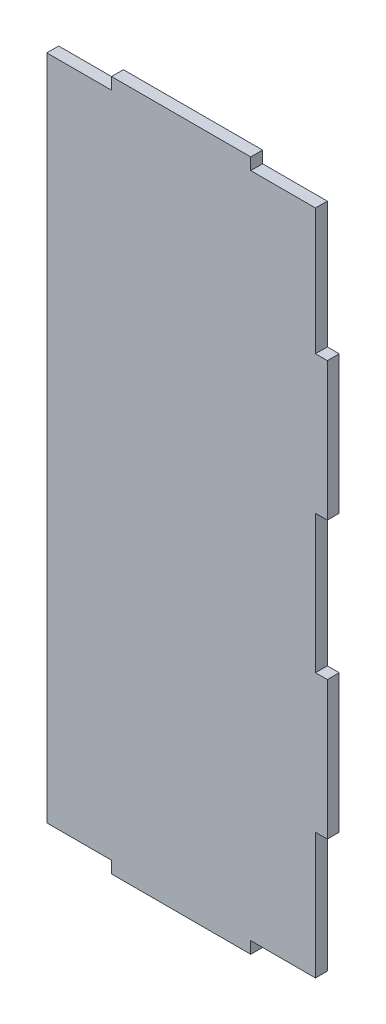
ISO-10303-21;
HEADER;
FILE_DESCRIPTION(('STEP AP214'),'2;1');
FILE_NAME('part.step','',(''),(''),'','','');
FILE_SCHEMA(('AUTOMOTIVE_DESIGN { 1 0 10303 214 1 1 1 1 }'));
ENDSEC;
DATA;
#1=APPLICATION_CONTEXT('core data for automotive mechanical design processes');
#2=APPLICATION_PROTOCOL_DEFINITION('international standard','automotive_design',2000,#1);
#3=PRODUCT_CONTEXT('',#1,'mechanical');
#4=PRODUCT('Part','Part','',(#3));
#5=PRODUCT_RELATED_PRODUCT_CATEGORY('part','',(#4));
#6=PRODUCT_DEFINITION_FORMATION('','',#4);
#7=PRODUCT_DEFINITION_CONTEXT('part definition',#1,'design');
#8=PRODUCT_DEFINITION('design','',#6,#7);
#9=PRODUCT_DEFINITION_SHAPE('','',#8);
#10=(LENGTH_UNIT() NAMED_UNIT(*) SI_UNIT(.MILLI.,.METRE.));
#11=(NAMED_UNIT(*) PLANE_ANGLE_UNIT() SI_UNIT($,.RADIAN.));
#12=(NAMED_UNIT(*) SI_UNIT($,.STERADIAN.) SOLID_ANGLE_UNIT());
#13=UNCERTAINTY_MEASURE_WITH_UNIT(LENGTH_MEASURE(1.E-05),#10,'distance_accuracy_value','');
#14=(GEOMETRIC_REPRESENTATION_CONTEXT(3) GLOBAL_UNCERTAINTY_ASSIGNED_CONTEXT((#13)) GLOBAL_UNIT_ASSIGNED_CONTEXT((#10,
#11,#12)) REPRESENTATION_CONTEXT('',''));
#15=CARTESIAN_POINT('',(0.,0.,0.));
#16=DIRECTION('',(0.,0.,1.));
#17=DIRECTION('',(1.,0.,0.));
#18=AXIS2_PLACEMENT_3D('',#15,#16,#17);
#19=CARTESIAN_POINT('',(75.4269948953106,366.820828603859,5.5));
#20=DIRECTION('',(-1.,0.,0.));
#21=DIRECTION('',(0.,0.,1.));
#22=AXIS2_PLACEMENT_3D('',#19,#20,#21);
#23=PLANE('',#22);
#24=DIRECTION('',(0.,1.,0.));
#25=VECTOR('',#24,1.);
#26=CARTESIAN_POINT('',(75.4269948953106,366.820828603859,0.));
#27=LINE('',#26,#25);
#28=CARTESIAN_POINT('',(75.4269948953106,308.320828603859,0.));
#29=VERTEX_POINT('',#28);
#30=CARTESIAN_POINT('',(75.4269948953106,366.820828603859,0.));
#31=VERTEX_POINT('',#30);
#32=EDGE_CURVE('E200',#29,#31,#27,.T.);
#33=ORIENTED_EDGE('',*,*,#32,.T.);
#34=DIRECTION('',(0.,0.,-1.));
#35=VECTOR('',#34,1.);
#36=CARTESIAN_POINT('',(75.4269948953106,366.820828603859,5.5));
#37=LINE('',#36,#35);
#38=CARTESIAN_POINT('',(75.4269948953106,366.820828603859,5.5));
#39=VERTEX_POINT('',#38);
#40=EDGE_CURVE('E11',#39,#31,#37,.T.);
#41=ORIENTED_EDGE('',*,*,#40,.F.);
#42=DIRECTION('',(0.,1.,0.));
#43=VECTOR('',#42,1.);
#44=CARTESIAN_POINT('',(75.4269948953106,366.820828603859,5.5));
#45=LINE('',#44,#43);
#46=CARTESIAN_POINT('',(75.4269948953106,308.320828603859,5.5));
#47=VERTEX_POINT('',#46);
#48=EDGE_CURVE('E238',#47,#39,#45,.T.);
#49=ORIENTED_EDGE('',*,*,#48,.F.);
#50=DIRECTION('',(0.,0.,-1.));
#51=VECTOR('',#50,1.);
#52=CARTESIAN_POINT('',(75.4269948953106,308.320828603859,5.5));
#53=LINE('',#52,#51);
#54=EDGE_CURVE('E196',#47,#29,#53,.T.);
#55=ORIENTED_EDGE('',*,*,#54,.T.);
#56=EDGE_LOOP('',(#33,#41,#49,#55));
#57=FACE_BOUND('',#56,.T.);
#58=ADVANCED_FACE('F32',(#57),#23,.F.);
#59=CARTESIAN_POINT('',(45.4269948953106,366.820828603859,5.5));
#60=DIRECTION('',(0.,-1.,0.));
#61=DIRECTION('',(0.,0.,-1.));
#62=AXIS2_PLACEMENT_3D('',#59,#60,#61);
#63=PLANE('',#62);
#64=DIRECTION('',(-1.,0.,0.));
#65=VECTOR('',#64,1.);
#66=CARTESIAN_POINT('',(45.4269948953106,366.820828603859,0.));
#67=LINE('',#66,#65);
#68=CARTESIAN_POINT('',(45.4269948953106,366.820828603859,0.));
#69=VERTEX_POINT('',#68);
#70=EDGE_CURVE('E203',#31,#69,#67,.T.);
#71=ORIENTED_EDGE('',*,*,#70,.T.);
#72=DIRECTION('',(0.,0.,-1.));
#73=VECTOR('',#72,1.);
#74=CARTESIAN_POINT('',(45.4269948953106,366.820828603859,5.5));
#75=LINE('',#74,#73);
#76=CARTESIAN_POINT('',(45.4269948953106,366.820828603859,5.5));
#77=VERTEX_POINT('',#76);
#78=EDGE_CURVE('E40',#77,#69,#75,.T.);
#79=ORIENTED_EDGE('',*,*,#78,.F.);
#80=DIRECTION('',(-1.,0.,0.));
#81=VECTOR('',#80,1.);
#82=CARTESIAN_POINT('',(45.4269948953106,366.820828603859,5.5));
#83=LINE('',#82,#81);
#84=EDGE_CURVE('E127',#39,#77,#83,.T.);
#85=ORIENTED_EDGE('',*,*,#84,.F.);
#86=ORIENTED_EDGE('',*,*,#40,.T.);
#87=EDGE_LOOP('',(#71,#79,#85,#86));
#88=FACE_BOUND('',#87,.T.);
#89=ADVANCED_FACE('F356',(#88),#63,.F.);
#90=CARTESIAN_POINT('',(45.4269948953106,366.820828603859,5.5));
#91=DIRECTION('',(-1.,0.,0.));
#92=DIRECTION('',(0.,0.,1.));
#93=AXIS2_PLACEMENT_3D('',#90,#91,#92);
#94=PLANE('',#93);
#95=DIRECTION('',(0.,1.,0.));
#96=VECTOR('',#95,1.);
#97=CARTESIAN_POINT('',(45.4269948953106,366.820828603859,0.));
#98=LINE('',#97,#96);
#99=CARTESIAN_POINT('',(45.4269948953106,372.320828603859,0.));
#100=VERTEX_POINT('',#99);
#101=EDGE_CURVE('E205',#69,#100,#98,.T.);
#102=ORIENTED_EDGE('',*,*,#101,.T.);
#103=DIRECTION('',(0.,0.,-1.));
#104=VECTOR('',#103,1.);
#105=CARTESIAN_POINT('',(45.4269948953106,372.320828603859,5.5));
#106=LINE('',#105,#104);
#107=CARTESIAN_POINT('',(45.4269948953106,372.320828603859,5.5));
#108=VERTEX_POINT('',#107);
#109=EDGE_CURVE('E281',#108,#100,#106,.T.);
#110=ORIENTED_EDGE('',*,*,#109,.F.);
#111=DIRECTION('',(0.,1.,0.));
#112=VECTOR('',#111,1.);
#113=CARTESIAN_POINT('',(45.4269948953106,366.820828603859,5.5));
#114=LINE('',#113,#112);
#115=EDGE_CURVE('E289',#77,#108,#114,.T.);
#116=ORIENTED_EDGE('',*,*,#115,.F.);
#117=ORIENTED_EDGE('',*,*,#78,.T.);
#118=EDGE_LOOP('',(#102,#110,#116,#117));
#119=FACE_BOUND('',#118,.T.);
#120=ADVANCED_FACE('F287',(#119),#94,.F.);
#121=CARTESIAN_POINT('',(45.4269948953106,372.320828603859,5.5));
#122=DIRECTION('',(0.,-1.,0.));
#123=DIRECTION('',(0.,0.,-1.));
#124=AXIS2_PLACEMENT_3D('',#121,#122,#123);
#125=PLANE('',#124);
#126=DIRECTION('',(-1.,0.,0.));
#127=VECTOR('',#126,1.);
#128=CARTESIAN_POINT('',(45.4269948953106,372.320828603859,0.));
#129=LINE('',#128,#127);
#130=CARTESIAN_POINT('',(-19.0730051046895,372.320828603859,0.));
#131=VERTEX_POINT('',#130);
#132=EDGE_CURVE('E207',#100,#131,#129,.T.);
#133=ORIENTED_EDGE('',*,*,#132,.T.);
#134=DIRECTION('',(0.,0.,-1.));
#135=VECTOR('',#134,1.);
#136=CARTESIAN_POINT('',(-19.0730051046895,372.320828603859,5.5));
#137=LINE('',#136,#135);
#138=CARTESIAN_POINT('',(-19.0730051046895,372.320828603859,5.5));
#139=VERTEX_POINT('',#138);
#140=EDGE_CURVE('E278',#139,#131,#137,.T.);
#141=ORIENTED_EDGE('',*,*,#140,.F.);
#142=DIRECTION('',(-1.,0.,0.));
#143=VECTOR('',#142,1.);
#144=CARTESIAN_POINT('',(45.4269948953106,372.320828603859,5.5));
#145=LINE('',#144,#143);
#146=EDGE_CURVE('E307',#108,#139,#145,.T.);
#147=ORIENTED_EDGE('',*,*,#146,.F.);
#148=ORIENTED_EDGE('',*,*,#109,.T.);
#149=EDGE_LOOP('',(#133,#141,#147,#148));
#150=FACE_BOUND('',#149,.T.);
#151=ADVANCED_FACE('F298',(#150),#125,.F.);
#152=CARTESIAN_POINT('',(-19.0730051046895,366.820828603859,5.5));
#153=DIRECTION('',(1.,0.,0.));
#154=DIRECTION('',(0.,0.,-1.));
#155=AXIS2_PLACEMENT_3D('',#152,#153,#154);
#156=PLANE('',#155);
#157=DIRECTION('',(0.,-1.,0.));
#158=VECTOR('',#157,1.);
#159=CARTESIAN_POINT('',(-19.0730051046895,366.820828603859,0.));
#160=LINE('',#159,#158);
#161=CARTESIAN_POINT('',(-19.0730051046895,366.820828603859,0.));
#162=VERTEX_POINT('',#161);
#163=EDGE_CURVE('E209',#131,#162,#160,.T.);
#164=ORIENTED_EDGE('',*,*,#163,.T.);
#165=DIRECTION('',(0.,0.,-1.));
#166=VECTOR('',#165,1.);
#167=CARTESIAN_POINT('',(-19.0730051046895,366.820828603859,5.5));
#168=LINE('',#167,#166);
#169=CARTESIAN_POINT('',(-19.0730051046895,366.820828603859,5.5));
#170=VERTEX_POINT('',#169);
#171=EDGE_CURVE('E275',#170,#162,#168,.T.);
#172=ORIENTED_EDGE('',*,*,#171,.F.);
#173=DIRECTION('',(0.,-1.,0.));
#174=VECTOR('',#173,1.);
#175=CARTESIAN_POINT('',(-19.0730051046895,366.820828603859,5.5));
#176=LINE('',#175,#174);
#177=EDGE_CURVE('E304',#139,#170,#176,.T.);
#178=ORIENTED_EDGE('',*,*,#177,.F.);
#179=ORIENTED_EDGE('',*,*,#140,.T.);
#180=EDGE_LOOP('',(#164,#172,#178,#179));
#181=FACE_BOUND('',#180,.T.);
#182=ADVANCED_FACE('F302',(#181),#156,.F.);
#183=CARTESIAN_POINT('',(-49.0730051046895,366.820828603859,5.5));
#184=DIRECTION('',(0.,-1.,0.));
#185=DIRECTION('',(0.,0.,-1.));
#186=AXIS2_PLACEMENT_3D('',#183,#184,#185);
#187=PLANE('',#186);
#188=DIRECTION('',(-1.,0.,0.));
#189=VECTOR('',#188,1.);
#190=CARTESIAN_POINT('',(-49.0730051046895,366.820828603859,0.));
#191=LINE('',#190,#189);
#192=CARTESIAN_POINT('',(-49.0730051046895,366.820828603859,0.));
#193=VERTEX_POINT('',#192);
#194=EDGE_CURVE('E211',#162,#193,#191,.T.);
#195=ORIENTED_EDGE('',*,*,#194,.T.);
#196=DIRECTION('',(0.,0.,-1.));
#197=VECTOR('',#196,1.);
#198=CARTESIAN_POINT('',(-49.0730051046895,366.820828603859,5.5));
#199=LINE('',#198,#197);
#200=CARTESIAN_POINT('',(-49.0730051046895,366.820828603859,5.5));
#201=VERTEX_POINT('',#200);
#202=EDGE_CURVE('E272',#201,#193,#199,.T.);
#203=ORIENTED_EDGE('',*,*,#202,.F.);
#204=DIRECTION('',(-1.,0.,0.));
#205=VECTOR('',#204,1.);
#206=CARTESIAN_POINT('',(-49.0730051046895,366.820828603859,5.5));
#207=LINE('',#206,#205);
#208=EDGE_CURVE('E306',#170,#201,#207,.T.);
#209=ORIENTED_EDGE('',*,*,#208,.F.);
#210=ORIENTED_EDGE('',*,*,#171,.T.);
#211=EDGE_LOOP('',(#195,#203,#209,#210));
#212=FACE_BOUND('',#211,.T.);
#213=ADVANCED_FACE('F369',(#212),#187,.F.);
#214=CARTESIAN_POINT('',(-49.0730051046895,57.8208286038593,5.5));
#215=DIRECTION('',(1.,0.,0.));
#216=DIRECTION('',(0.,1.,0.));
#217=AXIS2_PLACEMENT_3D('',#214,#215,#216);
#218=PLANE('',#217);
#219=DIRECTION('',(0.,-1.,0.));
#220=VECTOR('',#219,1.);
#221=CARTESIAN_POINT('',(-49.0730051046895,57.8208286038593,0.));
#222=LINE('',#221,#220);
#223=CARTESIAN_POINT('',(-49.0730051046895,57.8208286038593,0.));
#224=VERTEX_POINT('',#223);
#225=EDGE_CURVE('E213',#193,#224,#222,.T.);
#226=ORIENTED_EDGE('',*,*,#225,.T.);
#227=DIRECTION('',(0.,0.,-1.));
#228=VECTOR('',#227,1.);
#229=CARTESIAN_POINT('',(-49.0730051046895,57.8208286038593,5.5));
#230=LINE('',#229,#228);
#231=CARTESIAN_POINT('',(-49.0730051046895,57.8208286038593,5.5));
#232=VERTEX_POINT('',#231);
#233=EDGE_CURVE('E269',#232,#224,#230,.T.);
#234=ORIENTED_EDGE('',*,*,#233,.F.);
#235=DIRECTION('',(0.,-1.,0.));
#236=VECTOR('',#235,1.);
#237=CARTESIAN_POINT('',(-49.0730051046895,57.8208286038593,5.5));
#238=LINE('',#237,#236);
#239=EDGE_CURVE('E309',#201,#232,#238,.T.);
#240=ORIENTED_EDGE('',*,*,#239,.F.);
#241=ORIENTED_EDGE('',*,*,#202,.T.);
#242=EDGE_LOOP('',(#226,#234,#240,#241));
#243=FACE_BOUND('',#242,.T.);
#244=ADVANCED_FACE('F372',(#243),#218,.F.);
#245=CARTESIAN_POINT('',(-19.0730051046895,57.8208286038593,5.5));
#246=DIRECTION('',(0.,1.,0.));
#247=DIRECTION('',(0.,0.,1.));
#248=AXIS2_PLACEMENT_3D('',#245,#246,#247);
#249=PLANE('',#248);
#250=DIRECTION('',(1.,0.,0.));
#251=VECTOR('',#250,1.);
#252=CARTESIAN_POINT('',(-19.0730051046895,57.8208286038593,0.));
#253=LINE('',#252,#251);
#254=CARTESIAN_POINT('',(-19.0730051046895,57.8208286038593,0.));
#255=VERTEX_POINT('',#254);
#256=EDGE_CURVE('E215',#224,#255,#253,.T.);
#257=ORIENTED_EDGE('',*,*,#256,.T.);
#258=DIRECTION('',(0.,0.,-1.));
#259=VECTOR('',#258,1.);
#260=CARTESIAN_POINT('',(-19.0730051046895,57.8208286038593,5.5));
#261=LINE('',#260,#259);
#262=CARTESIAN_POINT('',(-19.0730051046895,57.8208286038593,5.5));
#263=VERTEX_POINT('',#262);
#264=EDGE_CURVE('E266',#263,#255,#261,.T.);
#265=ORIENTED_EDGE('',*,*,#264,.F.);
#266=DIRECTION('',(1.,0.,0.));
#267=VECTOR('',#266,1.);
#268=CARTESIAN_POINT('',(-19.0730051046895,57.8208286038593,5.5));
#269=LINE('',#268,#267);
#270=EDGE_CURVE('E315',#232,#263,#269,.T.);
#271=ORIENTED_EDGE('',*,*,#270,.F.);
#272=ORIENTED_EDGE('',*,*,#233,.T.);
#273=EDGE_LOOP('',(#257,#265,#271,#272));
#274=FACE_BOUND('',#273,.T.);
#275=ADVANCED_FACE('F376',(#274),#249,.F.);
#276=CARTESIAN_POINT('',(-19.0730051046895,57.8208286038593,5.5));
#277=DIRECTION('',(1.,0.,0.));
#278=DIRECTION('',(0.,0.,-1.));
#279=AXIS2_PLACEMENT_3D('',#276,#277,#278);
#280=PLANE('',#279);
#281=DIRECTION('',(0.,-1.,0.));
#282=VECTOR('',#281,1.);
#283=CARTESIAN_POINT('',(-19.0730051046895,57.8208286038593,0.));
#284=LINE('',#283,#282);
#285=CARTESIAN_POINT('',(-19.0730051046895,52.3208286038593,0.));
#286=VERTEX_POINT('',#285);
#287=EDGE_CURVE('E217',#255,#286,#284,.T.);
#288=ORIENTED_EDGE('',*,*,#287,.T.);
#289=DIRECTION('',(0.,0.,-1.));
#290=VECTOR('',#289,1.);
#291=CARTESIAN_POINT('',(-19.0730051046895,52.3208286038593,5.5));
#292=LINE('',#291,#290);
#293=CARTESIAN_POINT('',(-19.0730051046895,52.3208286038593,5.5));
#294=VERTEX_POINT('',#293);
#295=EDGE_CURVE('E263',#294,#286,#292,.T.);
#296=ORIENTED_EDGE('',*,*,#295,.F.);
#297=DIRECTION('',(0.,-1.,0.));
#298=VECTOR('',#297,1.);
#299=CARTESIAN_POINT('',(-19.0730051046895,57.8208286038593,5.5));
#300=LINE('',#299,#298);
#301=EDGE_CURVE('E317',#263,#294,#300,.T.);
#302=ORIENTED_EDGE('',*,*,#301,.F.);
#303=ORIENTED_EDGE('',*,*,#264,.T.);
#304=EDGE_LOOP('',(#288,#296,#302,#303));
#305=FACE_BOUND('',#304,.T.);
#306=ADVANCED_FACE('F380',(#305),#280,.F.);
#307=CARTESIAN_POINT('',(-19.0730051046895,52.3208286038593,5.5));
#308=DIRECTION('',(0.,1.,0.));
#309=DIRECTION('',(0.,0.,1.));
#310=AXIS2_PLACEMENT_3D('',#307,#308,#309);
#311=PLANE('',#310);
#312=DIRECTION('',(1.,0.,0.));
#313=VECTOR('',#312,1.);
#314=CARTESIAN_POINT('',(-19.0730051046895,52.3208286038593,0.));
#315=LINE('',#314,#313);
#316=CARTESIAN_POINT('',(45.4269948953106,52.3208286038593,0.));
#317=VERTEX_POINT('',#316);
#318=EDGE_CURVE('E219',#286,#317,#315,.T.);
#319=ORIENTED_EDGE('',*,*,#318,.T.);
#320=DIRECTION('',(0.,0.,-1.));
#321=VECTOR('',#320,1.);
#322=CARTESIAN_POINT('',(45.4269948953106,52.3208286038593,5.5));
#323=LINE('',#322,#321);
#324=CARTESIAN_POINT('',(45.4269948953106,52.3208286038593,5.5));
#325=VERTEX_POINT('',#324);
#326=EDGE_CURVE('E260',#325,#317,#323,.T.);
#327=ORIENTED_EDGE('',*,*,#326,.F.);
#328=DIRECTION('',(1.,0.,0.));
#329=VECTOR('',#328,1.);
#330=CARTESIAN_POINT('',(-19.0730051046895,52.3208286038593,5.5));
#331=LINE('',#330,#329);
#332=EDGE_CURVE('E319',#294,#325,#331,.T.);
#333=ORIENTED_EDGE('',*,*,#332,.F.);
#334=ORIENTED_EDGE('',*,*,#295,.T.);
#335=EDGE_LOOP('',(#319,#327,#333,#334));
#336=FACE_BOUND('',#335,.T.);
#337=ADVANCED_FACE('F384',(#336),#311,.F.);
#338=CARTESIAN_POINT('',(45.4269948953106,52.3208286038593,5.5));
#339=DIRECTION('',(-1.,0.,0.));
#340=DIRECTION('',(0.,0.,1.));
#341=AXIS2_PLACEMENT_3D('',#338,#339,#340);
#342=PLANE('',#341);
#343=DIRECTION('',(0.,1.,0.));
#344=VECTOR('',#343,1.);
#345=CARTESIAN_POINT('',(45.4269948953106,52.3208286038593,0.));
#346=LINE('',#345,#344);
#347=CARTESIAN_POINT('',(45.4269948953106,57.8208286038593,0.));
#348=VERTEX_POINT('',#347);
#349=EDGE_CURVE('E221',#317,#348,#346,.T.);
#350=ORIENTED_EDGE('',*,*,#349,.T.);
#351=DIRECTION('',(0.,0.,-1.));
#352=VECTOR('',#351,1.);
#353=CARTESIAN_POINT('',(45.4269948953106,57.8208286038593,5.5));
#354=LINE('',#353,#352);
#355=CARTESIAN_POINT('',(45.4269948953106,57.8208286038593,5.5));
#356=VERTEX_POINT('',#355);
#357=EDGE_CURVE('E257',#356,#348,#354,.T.);
#358=ORIENTED_EDGE('',*,*,#357,.F.);
#359=DIRECTION('',(0.,1.,0.));
#360=VECTOR('',#359,1.);
#361=CARTESIAN_POINT('',(45.4269948953106,52.3208286038593,5.5));
#362=LINE('',#361,#360);
#363=EDGE_CURVE('E321',#325,#356,#362,.T.);
#364=ORIENTED_EDGE('',*,*,#363,.F.);
#365=ORIENTED_EDGE('',*,*,#326,.T.);
#366=EDGE_LOOP('',(#350,#358,#364,#365));
#367=FACE_BOUND('',#366,.T.);
#368=ADVANCED_FACE('F388',(#367),#342,.F.);
#369=CARTESIAN_POINT('',(45.4269948953106,57.8208286038593,5.5));
#370=DIRECTION('',(0.,1.,0.));
#371=DIRECTION('',(0.,0.,1.));
#372=AXIS2_PLACEMENT_3D('',#369,#370,#371);
#373=PLANE('',#372);
#374=DIRECTION('',(1.,0.,0.));
#375=VECTOR('',#374,1.);
#376=CARTESIAN_POINT('',(45.4269948953106,57.8208286038593,0.));
#377=LINE('',#376,#375);
#378=CARTESIAN_POINT('',(75.4269948953106,57.8208286038593,0.));
#379=VERTEX_POINT('',#378);
#380=EDGE_CURVE('E223',#348,#379,#377,.T.);
#381=ORIENTED_EDGE('',*,*,#380,.T.);
#382=DIRECTION('',(0.,0.,-1.));
#383=VECTOR('',#382,1.);
#384=CARTESIAN_POINT('',(75.4269948953106,57.8208286038593,5.5));
#385=LINE('',#384,#383);
#386=CARTESIAN_POINT('',(75.4269948953106,57.8208286038593,5.5));
#387=VERTEX_POINT('',#386);
#388=EDGE_CURVE('E254',#387,#379,#385,.T.);
#389=ORIENTED_EDGE('',*,*,#388,.F.);
#390=DIRECTION('',(1.,0.,0.));
#391=VECTOR('',#390,1.);
#392=CARTESIAN_POINT('',(45.4269948953106,57.8208286038593,5.5));
#393=LINE('',#392,#391);
#394=EDGE_CURVE('E323',#356,#387,#393,.T.);
#395=ORIENTED_EDGE('',*,*,#394,.F.);
#396=ORIENTED_EDGE('',*,*,#357,.T.);
#397=EDGE_LOOP('',(#381,#389,#395,#396));
#398=FACE_BOUND('',#397,.T.);
#399=ADVANCED_FACE('F392',(#398),#373,.F.);
#400=CARTESIAN_POINT('',(75.4269948953106,57.8208286038593,5.5));
#401=DIRECTION('',(-1.,0.,0.));
#402=DIRECTION('',(0.,0.,1.));
#403=AXIS2_PLACEMENT_3D('',#400,#401,#402);
#404=PLANE('',#403);
#405=DIRECTION('',(0.,1.,0.));
#406=VECTOR('',#405,1.);
#407=CARTESIAN_POINT('',(75.4269948953106,57.8208286038593,0.));
#408=LINE('',#407,#406);
#409=CARTESIAN_POINT('',(75.4269948953106,116.320828603859,0.));
#410=VERTEX_POINT('',#409);
#411=EDGE_CURVE('E225',#379,#410,#408,.T.);
#412=ORIENTED_EDGE('',*,*,#411,.T.);
#413=DIRECTION('',(0.,0.,-1.));
#414=VECTOR('',#413,1.);
#415=CARTESIAN_POINT('',(75.4269948953106,116.320828603859,5.5));
#416=LINE('',#415,#414);
#417=CARTESIAN_POINT('',(75.4269948953106,116.320828603859,5.5));
#418=VERTEX_POINT('',#417);
#419=EDGE_CURVE('E251',#418,#410,#416,.T.);
#420=ORIENTED_EDGE('',*,*,#419,.F.);
#421=DIRECTION('',(0.,1.,0.));
#422=VECTOR('',#421,1.);
#423=CARTESIAN_POINT('',(75.4269948953106,57.8208286038593,5.5));
#424=LINE('',#423,#422);
#425=EDGE_CURVE('E325',#387,#418,#424,.T.);
#426=ORIENTED_EDGE('',*,*,#425,.F.);
#427=ORIENTED_EDGE('',*,*,#388,.T.);
#428=EDGE_LOOP('',(#412,#420,#426,#427));
#429=FACE_BOUND('',#428,.T.);
#430=ADVANCED_FACE('F396',(#429),#404,.F.);
#431=CARTESIAN_POINT('',(75.4269948953106,116.320828603859,5.5));
#432=DIRECTION('',(0.,1.,0.));
#433=DIRECTION('',(0.,0.,1.));
#434=AXIS2_PLACEMENT_3D('',#431,#432,#433);
#435=PLANE('',#434);
#436=DIRECTION('',(1.,0.,0.));
#437=VECTOR('',#436,1.);
#438=CARTESIAN_POINT('',(75.4269948953106,116.320828603859,0.));
#439=LINE('',#438,#437);
#440=CARTESIAN_POINT('',(80.9269948953106,116.320828603859,0.));
#441=VERTEX_POINT('',#440);
#442=EDGE_CURVE('E227',#410,#441,#439,.T.);
#443=ORIENTED_EDGE('',*,*,#442,.T.);
#444=DIRECTION('',(0.,0.,-1.));
#445=VECTOR('',#444,1.);
#446=CARTESIAN_POINT('',(80.9269948953106,116.320828603859,5.5));
#447=LINE('',#446,#445);
#448=CARTESIAN_POINT('',(80.9269948953106,116.320828603859,5.5));
#449=VERTEX_POINT('',#448);
#450=EDGE_CURVE('E248',#449,#441,#447,.T.);
#451=ORIENTED_EDGE('',*,*,#450,.F.);
#452=DIRECTION('',(1.,0.,0.));
#453=VECTOR('',#452,1.);
#454=CARTESIAN_POINT('',(75.4269948953106,116.320828603859,5.5));
#455=LINE('',#454,#453);
#456=EDGE_CURVE('E327',#418,#449,#455,.T.);
#457=ORIENTED_EDGE('',*,*,#456,.F.);
#458=ORIENTED_EDGE('',*,*,#419,.T.);
#459=EDGE_LOOP('',(#443,#451,#457,#458));
#460=FACE_BOUND('',#459,.T.);
#461=ADVANCED_FACE('F400',(#460),#435,.F.);
#462=CARTESIAN_POINT('',(80.9269948953106,116.320828603859,5.5));
#463=DIRECTION('',(-1.,0.,0.));
#464=DIRECTION('',(0.,0.,1.));
#465=AXIS2_PLACEMENT_3D('',#462,#463,#464);
#466=PLANE('',#465);
#467=DIRECTION('',(0.,1.,0.));
#468=VECTOR('',#467,1.);
#469=CARTESIAN_POINT('',(80.9269948953106,116.320828603859,0.));
#470=LINE('',#469,#468);
#471=CARTESIAN_POINT('',(80.9269948953106,180.320828603859,0.));
#472=VERTEX_POINT('',#471);
#473=EDGE_CURVE('E229',#441,#472,#470,.T.);
#474=ORIENTED_EDGE('',*,*,#473,.T.);
#475=DIRECTION('',(0.,0.,-1.));
#476=VECTOR('',#475,1.);
#477=CARTESIAN_POINT('',(80.9269948953106,180.320828603859,5.5));
#478=LINE('',#477,#476);
#479=CARTESIAN_POINT('',(80.9269948953106,180.320828603859,5.5));
#480=VERTEX_POINT('',#479);
#481=EDGE_CURVE('E245',#480,#472,#478,.T.);
#482=ORIENTED_EDGE('',*,*,#481,.F.);
#483=DIRECTION('',(0.,1.,0.));
#484=VECTOR('',#483,1.);
#485=CARTESIAN_POINT('',(80.9269948953106,116.320828603859,5.5));
#486=LINE('',#485,#484);
#487=EDGE_CURVE('E329',#449,#480,#486,.T.);
#488=ORIENTED_EDGE('',*,*,#487,.F.);
#489=ORIENTED_EDGE('',*,*,#450,.T.);
#490=EDGE_LOOP('',(#474,#482,#488,#489));
#491=FACE_BOUND('',#490,.T.);
#492=ADVANCED_FACE('F404',(#491),#466,.F.);
#493=CARTESIAN_POINT('',(75.4269948953106,180.320828603859,5.5));
#494=DIRECTION('',(0.,-1.,0.));
#495=DIRECTION('',(0.,0.,-1.));
#496=AXIS2_PLACEMENT_3D('',#493,#494,#495);
#497=PLANE('',#496);
#498=DIRECTION('',(-1.,0.,0.));
#499=VECTOR('',#498,1.);
#500=CARTESIAN_POINT('',(75.4269948953106,180.320828603859,0.));
#501=LINE('',#500,#499);
#502=CARTESIAN_POINT('',(75.4269948953106,180.320828603859,0.));
#503=VERTEX_POINT('',#502);
#504=EDGE_CURVE('E231',#472,#503,#501,.T.);
#505=ORIENTED_EDGE('',*,*,#504,.T.);
#506=DIRECTION('',(0.,0.,-1.));
#507=VECTOR('',#506,1.);
#508=CARTESIAN_POINT('',(75.4269948953106,180.320828603859,5.5));
#509=LINE('',#508,#507);
#510=CARTESIAN_POINT('',(75.4269948953106,180.320828603859,5.5));
#511=VERTEX_POINT('',#510);
#512=EDGE_CURVE('E242',#511,#503,#509,.T.);
#513=ORIENTED_EDGE('',*,*,#512,.F.);
#514=DIRECTION('',(-1.,0.,0.));
#515=VECTOR('',#514,1.);
#516=CARTESIAN_POINT('',(75.4269948953106,180.320828603859,5.5));
#517=LINE('',#516,#515);
#518=EDGE_CURVE('E331',#480,#511,#517,.T.);
#519=ORIENTED_EDGE('',*,*,#518,.F.);
#520=ORIENTED_EDGE('',*,*,#481,.T.);
#521=EDGE_LOOP('',(#505,#513,#519,#520));
#522=FACE_BOUND('',#521,.T.);
#523=ADVANCED_FACE('F337',(#522),#497,.F.);
#524=CARTESIAN_POINT('',(75.4269948953106,180.320828603859,5.5));
#525=DIRECTION('',(-1.,0.,0.));
#526=DIRECTION('',(0.,0.,1.));
#527=AXIS2_PLACEMENT_3D('',#524,#525,#526);
#528=PLANE('',#527);
#529=DIRECTION('',(0.,1.,0.));
#530=VECTOR('',#529,1.);
#531=CARTESIAN_POINT('',(75.4269948953106,180.320828603859,0.));
#532=LINE('',#531,#530);
#533=CARTESIAN_POINT('',(75.4269948953106,244.320828603859,0.));
#534=VERTEX_POINT('',#533);
#535=EDGE_CURVE('E233',#503,#534,#532,.T.);
#536=ORIENTED_EDGE('',*,*,#535,.T.);
#537=DIRECTION('',(0.,0.,-1.));
#538=VECTOR('',#537,1.);
#539=CARTESIAN_POINT('',(75.4269948953106,244.320828603859,5.5));
#540=LINE('',#539,#538);
#541=CARTESIAN_POINT('',(75.4269948953106,244.320828603859,5.5));
#542=VERTEX_POINT('',#541);
#543=EDGE_CURVE('E191',#542,#534,#540,.T.);
#544=ORIENTED_EDGE('',*,*,#543,.F.);
#545=DIRECTION('',(0.,1.,0.));
#546=VECTOR('',#545,1.);
#547=CARTESIAN_POINT('',(75.4269948953106,180.320828603859,5.5));
#548=LINE('',#547,#546);
#549=EDGE_CURVE('E182',#511,#542,#548,.T.);
#550=ORIENTED_EDGE('',*,*,#549,.F.);
#551=ORIENTED_EDGE('',*,*,#512,.T.);
#552=EDGE_LOOP('',(#536,#544,#550,#551));
#553=FACE_BOUND('',#552,.T.);
#554=ADVANCED_FACE('F341',(#553),#528,.F.);
#555=CARTESIAN_POINT('',(80.9269948953106,244.320828603859,5.5));
#556=DIRECTION('',(0.,1.,0.));
#557=DIRECTION('',(0.,0.,1.));
#558=AXIS2_PLACEMENT_3D('',#555,#556,#557);
#559=PLANE('',#558);
#560=DIRECTION('',(1.,0.,0.));
#561=VECTOR('',#560,1.);
#562=CARTESIAN_POINT('',(80.9269948953106,244.320828603859,0.));
#563=LINE('',#562,#561);
#564=CARTESIAN_POINT('',(80.9269948953106,244.320828603859,0.));
#565=VERTEX_POINT('',#564);
#566=EDGE_CURVE('E190',#534,#565,#563,.T.);
#567=ORIENTED_EDGE('',*,*,#566,.T.);
#568=DIRECTION('',(0.,0.,-1.));
#569=VECTOR('',#568,1.);
#570=CARTESIAN_POINT('',(80.9269948953106,244.320828603859,5.5));
#571=LINE('',#570,#569);
#572=CARTESIAN_POINT('',(80.9269948953106,244.320828603859,5.5));
#573=VERTEX_POINT('',#572);
#574=EDGE_CURVE('E187',#573,#565,#571,.T.);
#575=ORIENTED_EDGE('',*,*,#574,.F.);
#576=DIRECTION('',(1.,0.,0.));
#577=VECTOR('',#576,1.);
#578=CARTESIAN_POINT('',(80.9269948953106,244.320828603859,5.5));
#579=LINE('',#578,#577);
#580=EDGE_CURVE('E176',#542,#573,#579,.T.);
#581=ORIENTED_EDGE('',*,*,#580,.F.);
#582=ORIENTED_EDGE('',*,*,#543,.T.);
#583=EDGE_LOOP('',(#567,#575,#581,#582));
#584=FACE_BOUND('',#583,.T.);
#585=ADVANCED_FACE('F188',(#584),#559,.F.);
#586=CARTESIAN_POINT('',(80.9269948953106,244.320828603859,5.5));
#587=DIRECTION('',(-1.,0.,0.));
#588=DIRECTION('',(0.,-1.,0.));
#589=AXIS2_PLACEMENT_3D('',#586,#587,#588);
#590=PLANE('',#589);
#591=DIRECTION('',(0.,1.,0.));
#592=VECTOR('',#591,1.);
#593=CARTESIAN_POINT('',(80.9269948953106,244.320828603859,0.));
#594=LINE('',#593,#592);
#595=CARTESIAN_POINT('',(80.9269948953106,308.320828603859,0.));
#596=VERTEX_POINT('',#595);
#597=EDGE_CURVE('E113',#565,#596,#594,.T.);
#598=ORIENTED_EDGE('',*,*,#597,.T.);
#599=DIRECTION('',(0.,0.,-1.));
#600=VECTOR('',#599,1.);
#601=CARTESIAN_POINT('',(80.9269948953106,308.320828603859,5.5));
#602=LINE('',#601,#600);
#603=CARTESIAN_POINT('',(80.9269948953106,308.320828603859,5.5));
#604=VERTEX_POINT('',#603);
#605=EDGE_CURVE('E192',#604,#596,#602,.T.);
#606=ORIENTED_EDGE('',*,*,#605,.F.);
#607=DIRECTION('',(0.,1.,0.));
#608=VECTOR('',#607,1.);
#609=CARTESIAN_POINT('',(80.9269948953106,244.320828603859,5.5));
#610=LINE('',#609,#608);
#611=EDGE_CURVE('E180',#573,#604,#610,.T.);
#612=ORIENTED_EDGE('',*,*,#611,.F.);
#613=ORIENTED_EDGE('',*,*,#574,.T.);
#614=EDGE_LOOP('',(#598,#606,#612,#613));
#615=FACE_BOUND('',#614,.T.);
#616=ADVANCED_FACE('F194',(#615),#590,.F.);
#617=CARTESIAN_POINT('',(75.4269948953106,308.320828603859,5.5));
#618=DIRECTION('',(0.,-1.,0.));
#619=DIRECTION('',(0.,0.,-1.));
#620=AXIS2_PLACEMENT_3D('',#617,#618,#619);
#621=PLANE('',#620);
#622=DIRECTION('',(-1.,0.,0.));
#623=VECTOR('',#622,1.);
#624=CARTESIAN_POINT('',(75.4269948953106,308.320828603859,0.));
#625=LINE('',#624,#623);
#626=EDGE_CURVE('E119',#596,#29,#625,.T.);
#627=ORIENTED_EDGE('',*,*,#626,.T.);
#628=ORIENTED_EDGE('',*,*,#54,.F.);
#629=DIRECTION('',(-1.,0.,0.));
#630=VECTOR('',#629,1.);
#631=CARTESIAN_POINT('',(75.4269948953106,308.320828603859,5.5));
#632=LINE('',#631,#630);
#633=EDGE_CURVE('E48',#604,#47,#632,.T.);
#634=ORIENTED_EDGE('',*,*,#633,.F.);
#635=ORIENTED_EDGE('',*,*,#605,.T.);
#636=EDGE_LOOP('',(#627,#628,#634,#635));
#637=FACE_BOUND('',#636,.T.);
#638=ADVANCED_FACE('F345',(#637),#621,.F.);
#639=CARTESIAN_POINT('',(0.,0.,5.5));
#640=DIRECTION('',(0.,0.,1.));
#641=DIRECTION('',(1.,0.,0.));
#642=AXIS2_PLACEMENT_3D('',#639,#640,#641);
#643=PLANE('',#642);
#644=ORIENTED_EDGE('',*,*,#48,.T.);
#645=ORIENTED_EDGE('',*,*,#84,.T.);
#646=ORIENTED_EDGE('',*,*,#115,.T.);
#647=ORIENTED_EDGE('',*,*,#146,.T.);
#648=ORIENTED_EDGE('',*,*,#177,.T.);
#649=ORIENTED_EDGE('',*,*,#208,.T.);
#650=ORIENTED_EDGE('',*,*,#239,.T.);
#651=ORIENTED_EDGE('',*,*,#270,.T.);
#652=ORIENTED_EDGE('',*,*,#301,.T.);
#653=ORIENTED_EDGE('',*,*,#332,.T.);
#654=ORIENTED_EDGE('',*,*,#363,.T.);
#655=ORIENTED_EDGE('',*,*,#394,.T.);
#656=ORIENTED_EDGE('',*,*,#425,.T.);
#657=ORIENTED_EDGE('',*,*,#456,.T.);
#658=ORIENTED_EDGE('',*,*,#487,.T.);
#659=ORIENTED_EDGE('',*,*,#518,.T.);
#660=ORIENTED_EDGE('',*,*,#549,.T.);
#661=ORIENTED_EDGE('',*,*,#580,.T.);
#662=ORIENTED_EDGE('',*,*,#611,.T.);
#663=ORIENTED_EDGE('',*,*,#633,.T.);
#664=EDGE_LOOP('',(#644,#645,#646,#647,#648,#649,#650,#651,#652,#653,#654,#655,#656,#657,#658,
#659,#660,#661,#662,#663));
#665=FACE_BOUND('',#664,.T.);
#666=ADVANCED_FACE('F178',(#665),#643,.T.);
#667=CARTESIAN_POINT('',(0.,0.,0.));
#668=DIRECTION('',(0.,0.,1.));
#669=DIRECTION('',(1.,0.,0.));
#670=AXIS2_PLACEMENT_3D('',#667,#668,#669);
#671=PLANE('',#670);
#672=ORIENTED_EDGE('',*,*,#32,.F.);
#673=ORIENTED_EDGE('',*,*,#626,.F.);
#674=ORIENTED_EDGE('',*,*,#597,.F.);
#675=ORIENTED_EDGE('',*,*,#566,.F.);
#676=ORIENTED_EDGE('',*,*,#535,.F.);
#677=ORIENTED_EDGE('',*,*,#504,.F.);
#678=ORIENTED_EDGE('',*,*,#473,.F.);
#679=ORIENTED_EDGE('',*,*,#442,.F.);
#680=ORIENTED_EDGE('',*,*,#411,.F.);
#681=ORIENTED_EDGE('',*,*,#380,.F.);
#682=ORIENTED_EDGE('',*,*,#349,.F.);
#683=ORIENTED_EDGE('',*,*,#318,.F.);
#684=ORIENTED_EDGE('',*,*,#287,.F.);
#685=ORIENTED_EDGE('',*,*,#256,.F.);
#686=ORIENTED_EDGE('',*,*,#225,.F.);
#687=ORIENTED_EDGE('',*,*,#194,.F.);
#688=ORIENTED_EDGE('',*,*,#163,.F.);
#689=ORIENTED_EDGE('',*,*,#132,.F.);
#690=ORIENTED_EDGE('',*,*,#101,.F.);
#691=ORIENTED_EDGE('',*,*,#70,.F.);
#692=EDGE_LOOP('',(#672,#673,#674,#675,#676,#677,#678,#679,#680,#681,#682,#683,#684,#685,#686,
#687,#688,#689,#690,#691));
#693=FACE_BOUND('',#692,.T.);
#694=ADVANCED_FACE('F293',(#693),#671,.F.);
#695=CLOSED_SHELL('',(#58,#89,#120,#151,#182,#213,#244,#275,#306,#337,#368,#399,#430,#461,#492,
#523,#554,#585,#616,#638,#666,#694));
#696=MANIFOLD_SOLID_BREP('B2',#695);
#697=ADVANCED_BREP_SHAPE_REPRESENTATION('',(#18,#696),#14);
#698=SHAPE_DEFINITION_REPRESENTATION(#9,#697);
ENDSEC;
END-ISO-10303-21;
